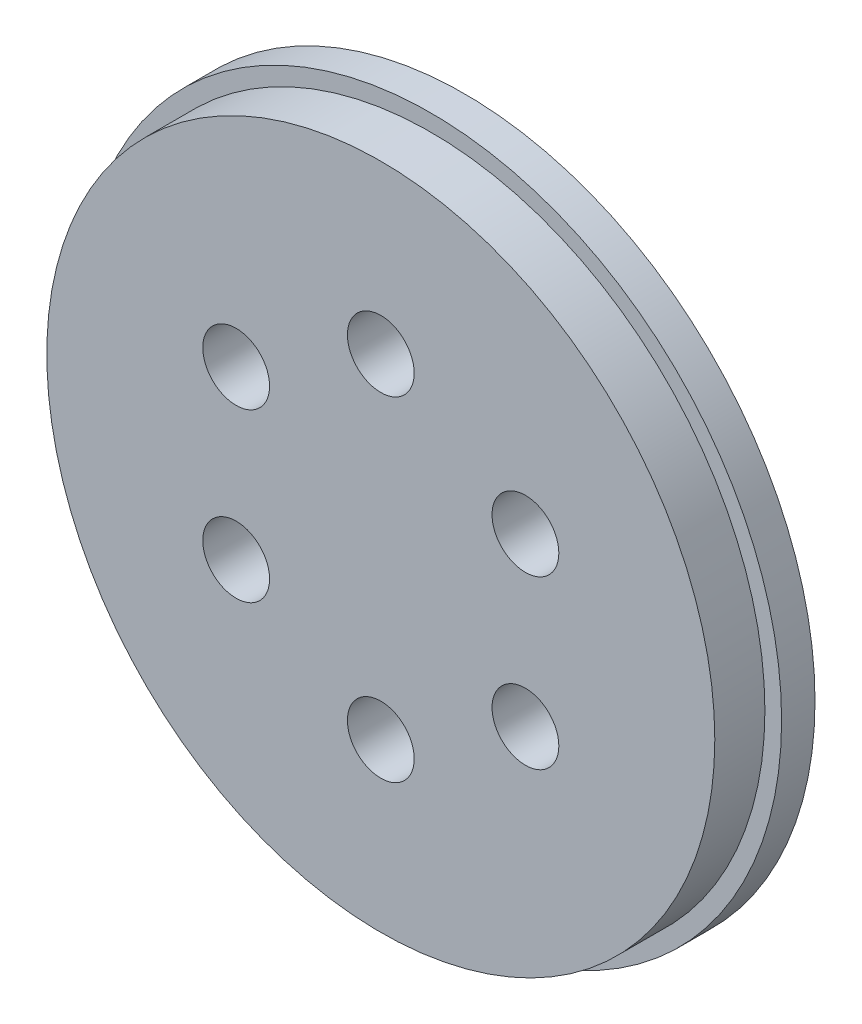
ISO-10303-21;
HEADER;
FILE_DESCRIPTION(('STEP AP214'),'2;1');
FILE_NAME('part.step','',(''),(''),'','','');
FILE_SCHEMA(('AUTOMOTIVE_DESIGN { 1 0 10303 214 1 1 1 1 }'));
ENDSEC;
DATA;
#1=APPLICATION_CONTEXT('core data for automotive mechanical design processes');
#2=APPLICATION_PROTOCOL_DEFINITION('international standard','automotive_design',2000,#1);
#3=PRODUCT_CONTEXT('',#1,'mechanical');
#4=PRODUCT('Part','Part','',(#3));
#5=PRODUCT_RELATED_PRODUCT_CATEGORY('part','',(#4));
#6=PRODUCT_DEFINITION_FORMATION('','',#4);
#7=PRODUCT_DEFINITION_CONTEXT('part definition',#1,'design');
#8=PRODUCT_DEFINITION('design','',#6,#7);
#9=PRODUCT_DEFINITION_SHAPE('','',#8);
#10=(LENGTH_UNIT() NAMED_UNIT(*) SI_UNIT(.MILLI.,.METRE.));
#11=(NAMED_UNIT(*) PLANE_ANGLE_UNIT() SI_UNIT($,.RADIAN.));
#12=(NAMED_UNIT(*) SI_UNIT($,.STERADIAN.) SOLID_ANGLE_UNIT());
#13=UNCERTAINTY_MEASURE_WITH_UNIT(LENGTH_MEASURE(1.E-05),#10,'distance_accuracy_value','');
#14=(GEOMETRIC_REPRESENTATION_CONTEXT(3) GLOBAL_UNCERTAINTY_ASSIGNED_CONTEXT((#13)) GLOBAL_UNIT_ASSIGNED_CONTEXT((#10,
#11,#12)) REPRESENTATION_CONTEXT('',''));
#15=CARTESIAN_POINT('',(0.,0.,0.));
#16=DIRECTION('',(0.,0.,1.));
#17=DIRECTION('',(1.,0.,0.));
#18=AXIS2_PLACEMENT_3D('',#15,#16,#17);
#19=CARTESIAN_POINT('',(0.,0.,2.));
#20=DIRECTION('',(0.,0.,-1.));
#21=DIRECTION('',(-1.,0.,0.));
#22=AXIS2_PLACEMENT_3D('',#19,#20,#21);
#23=CYLINDRICAL_SURFACE('',#22,21.);
#24=CARTESIAN_POINT('',(0.,0.,2.));
#25=DIRECTION('',(0.,0.,1.));
#26=DIRECTION('',(1.,0.,0.));
#27=AXIS2_PLACEMENT_3D('',#24,#25,#26);
#28=CIRCLE('',#27,21.);
#29=CARTESIAN_POINT('',(21.,0.,2.));
#30=VERTEX_POINT('',#29);
#31=EDGE_CURVE('E10',#30,#30,#28,.T.);
#32=ORIENTED_EDGE('',*,*,#31,.F.);
#33=EDGE_LOOP('',(#32));
#34=FACE_BOUND('',#33,.T.);
#35=CARTESIAN_POINT('',(0.,0.,0.));
#36=DIRECTION('',(0.,0.,1.));
#37=DIRECTION('',(1.,0.,0.));
#38=AXIS2_PLACEMENT_3D('',#35,#36,#37);
#39=CIRCLE('',#38,21.);
#40=CARTESIAN_POINT('',(21.,0.,0.));
#41=VERTEX_POINT('',#40);
#42=EDGE_CURVE('E37',#41,#41,#39,.T.);
#43=ORIENTED_EDGE('',*,*,#42,.T.);
#44=EDGE_LOOP('',(#43));
#45=FACE_BOUND('',#44,.T.);
#46=ADVANCED_FACE('F34',(#34,#45),#23,.T.);
#47=CARTESIAN_POINT('',(0.,0.,2.));
#48=DIRECTION('',(0.,0.,1.));
#49=DIRECTION('',(1.,0.,0.));
#50=AXIS2_PLACEMENT_3D('',#47,#48,#49);
#51=PLANE('',#50);
#52=CARTESIAN_POINT('',(0.,0.,2.));
#53=DIRECTION('',(0.,0.,1.));
#54=DIRECTION('',(1.,0.,0.));
#55=AXIS2_PLACEMENT_3D('',#52,#53,#54);
#56=CIRCLE('',#55,20.);
#57=CARTESIAN_POINT('',(20.,0.,2.));
#58=VERTEX_POINT('',#57);
#59=EDGE_CURVE('E46',#58,#58,#56,.T.);
#60=ORIENTED_EDGE('',*,*,#59,.F.);
#61=EDGE_LOOP('',(#60));
#62=FACE_BOUND('',#61,.T.);
#63=ORIENTED_EDGE('',*,*,#31,.T.);
#64=EDGE_LOOP('',(#63));
#65=FACE_BOUND('',#64,.T.);
#66=ADVANCED_FACE('F121',(#62,#65),#51,.T.);
#67=CARTESIAN_POINT('',(0.,0.,0.));
#68=DIRECTION('',(0.,0.,1.));
#69=DIRECTION('',(1.,0.,0.));
#70=AXIS2_PLACEMENT_3D('',#67,#68,#69);
#71=PLANE('',#70);
#72=CARTESIAN_POINT('',(8.66025403784502,5.00000000000111,0.));
#73=DIRECTION('',(0.,0.,1.));
#74=DIRECTION('',(1.,0.,0.));
#75=AXIS2_PLACEMENT_3D('',#72,#73,#74);
#76=CIRCLE('',#75,2.);
#77=CARTESIAN_POINT('',(10.660254037845,5.00000000000111,0.));
#78=VERTEX_POINT('',#77);
#79=EDGE_CURVE('E55',#78,#78,#76,.T.);
#80=ORIENTED_EDGE('',*,*,#79,.T.);
#81=EDGE_LOOP('',(#80));
#82=FACE_BOUND('',#81,.T.);
#83=CARTESIAN_POINT('',(8.6602540378463,-4.99999999999889,0.));
#84=DIRECTION('',(0.,0.,1.));
#85=DIRECTION('',(1.,0.,0.));
#86=AXIS2_PLACEMENT_3D('',#83,#84,#85);
#87=CIRCLE('',#86,2.);
#88=CARTESIAN_POINT('',(10.6602540378463,-4.99999999999889,0.));
#89=VERTEX_POINT('',#88);
#90=EDGE_CURVE('E79',#89,#89,#87,.T.);
#91=ORIENTED_EDGE('',*,*,#90,.T.);
#92=EDGE_LOOP('',(#91));
#93=FACE_BOUND('',#92,.T.);
#94=CARTESIAN_POINT('',(2.55366758493934E-12,-10.,0.));
#95=DIRECTION('',(0.,0.,1.));
#96=DIRECTION('',(1.,0.,0.));
#97=AXIS2_PLACEMENT_3D('',#94,#95,#96);
#98=CIRCLE('',#97,2.);
#99=CARTESIAN_POINT('',(2.00000000000255,-10.,0.));
#100=VERTEX_POINT('',#99);
#101=EDGE_CURVE('E73',#100,#100,#98,.T.);
#102=ORIENTED_EDGE('',*,*,#101,.T.);
#103=EDGE_LOOP('',(#102));
#104=FACE_BOUND('',#103,.T.);
#105=CARTESIAN_POINT('',(-8.66025403784247,-5.00000000000111,0.));
#106=DIRECTION('',(0.,0.,1.));
#107=DIRECTION('',(1.,0.,0.));
#108=AXIS2_PLACEMENT_3D('',#105,#106,#107);
#109=CIRCLE('',#108,2.);
#110=CARTESIAN_POINT('',(-6.66025403784247,-5.00000000000111,0.));
#111=VERTEX_POINT('',#110);
#112=EDGE_CURVE('E67',#111,#111,#109,.T.);
#113=ORIENTED_EDGE('',*,*,#112,.T.);
#114=EDGE_LOOP('',(#113));
#115=FACE_BOUND('',#114,.T.);
#116=CARTESIAN_POINT('',(-8.66025403784375,4.99999999999889,0.));
#117=DIRECTION('',(0.,0.,1.));
#118=DIRECTION('',(1.,0.,0.));
#119=AXIS2_PLACEMENT_3D('',#116,#117,#118);
#120=CIRCLE('',#119,2.);
#121=CARTESIAN_POINT('',(-6.66025403784375,4.99999999999889,0.));
#122=VERTEX_POINT('',#121);
#123=EDGE_CURVE('E61',#122,#122,#120,.T.);
#124=ORIENTED_EDGE('',*,*,#123,.T.);
#125=EDGE_LOOP('',(#124));
#126=FACE_BOUND('',#125,.T.);
#127=CARTESIAN_POINT('',(0.,10.,0.));
#128=DIRECTION('',(0.,0.,1.));
#129=DIRECTION('',(1.,0.,0.));
#130=AXIS2_PLACEMENT_3D('',#127,#128,#129);
#131=CIRCLE('',#130,2.);
#132=CARTESIAN_POINT('',(2.,10.,0.));
#133=VERTEX_POINT('',#132);
#134=EDGE_CURVE('E49',#133,#133,#131,.T.);
#135=ORIENTED_EDGE('',*,*,#134,.T.);
#136=EDGE_LOOP('',(#135));
#137=FACE_BOUND('',#136,.T.);
#138=ORIENTED_EDGE('',*,*,#42,.F.);
#139=EDGE_LOOP('',(#138));
#140=FACE_BOUND('',#139,.T.);
#141=ADVANCED_FACE('F88',(#82,#93,#104,#115,#126,#137,#140),#71,.F.);
#142=CARTESIAN_POINT('',(0.,0.,5.));
#143=DIRECTION('',(0.,0.,-1.));
#144=DIRECTION('',(-1.,0.,0.));
#145=AXIS2_PLACEMENT_3D('',#142,#143,#144);
#146=CYLINDRICAL_SURFACE('',#145,20.);
#147=CARTESIAN_POINT('',(0.,0.,5.));
#148=DIRECTION('',(0.,0.,1.));
#149=DIRECTION('',(1.,0.,0.));
#150=AXIS2_PLACEMENT_3D('',#147,#148,#149);
#151=CIRCLE('',#150,20.);
#152=CARTESIAN_POINT('',(20.,0.,5.));
#153=VERTEX_POINT('',#152);
#154=EDGE_CURVE('E44',#153,#153,#151,.T.);
#155=ORIENTED_EDGE('',*,*,#154,.F.);
#156=EDGE_LOOP('',(#155));
#157=FACE_BOUND('',#156,.T.);
#158=ORIENTED_EDGE('',*,*,#59,.T.);
#159=EDGE_LOOP('',(#158));
#160=FACE_BOUND('',#159,.T.);
#161=ADVANCED_FACE('F102',(#157,#160),#146,.T.);
#162=CARTESIAN_POINT('',(0.,0.,5.));
#163=DIRECTION('',(0.,0.,1.));
#164=DIRECTION('',(1.,0.,0.));
#165=AXIS2_PLACEMENT_3D('',#162,#163,#164);
#166=PLANE('',#165);
#167=CARTESIAN_POINT('',(8.66025403784502,5.00000000000111,5.));
#168=DIRECTION('',(0.,0.,1.));
#169=DIRECTION('',(1.,0.,0.));
#170=AXIS2_PLACEMENT_3D('',#167,#168,#169);
#171=CIRCLE('',#170,2.);
#172=CARTESIAN_POINT('',(10.660254037845,5.00000000000111,5.));
#173=VERTEX_POINT('',#172);
#174=EDGE_CURVE('E82',#173,#173,#171,.T.);
#175=ORIENTED_EDGE('',*,*,#174,.F.);
#176=EDGE_LOOP('',(#175));
#177=FACE_BOUND('',#176,.T.);
#178=CARTESIAN_POINT('',(8.6602540378463,-4.99999999999889,5.));
#179=DIRECTION('',(0.,0.,1.));
#180=DIRECTION('',(1.,0.,0.));
#181=AXIS2_PLACEMENT_3D('',#178,#179,#180);
#182=CIRCLE('',#181,2.);
#183=CARTESIAN_POINT('',(10.6602540378463,-4.99999999999889,5.));
#184=VERTEX_POINT('',#183);
#185=EDGE_CURVE('E76',#184,#184,#182,.T.);
#186=ORIENTED_EDGE('',*,*,#185,.F.);
#187=EDGE_LOOP('',(#186));
#188=FACE_BOUND('',#187,.T.);
#189=CARTESIAN_POINT('',(2.55366758493934E-12,-10.,5.));
#190=DIRECTION('',(0.,0.,1.));
#191=DIRECTION('',(1.,0.,0.));
#192=AXIS2_PLACEMENT_3D('',#189,#190,#191);
#193=CIRCLE('',#192,2.);
#194=CARTESIAN_POINT('',(2.00000000000255,-10.,5.));
#195=VERTEX_POINT('',#194);
#196=EDGE_CURVE('E70',#195,#195,#193,.T.);
#197=ORIENTED_EDGE('',*,*,#196,.F.);
#198=EDGE_LOOP('',(#197));
#199=FACE_BOUND('',#198,.T.);
#200=CARTESIAN_POINT('',(-8.66025403784247,-5.00000000000111,5.));
#201=DIRECTION('',(0.,0.,1.));
#202=DIRECTION('',(1.,0.,0.));
#203=AXIS2_PLACEMENT_3D('',#200,#201,#202);
#204=CIRCLE('',#203,2.);
#205=CARTESIAN_POINT('',(-6.66025403784247,-5.00000000000111,5.));
#206=VERTEX_POINT('',#205);
#207=EDGE_CURVE('E64',#206,#206,#204,.T.);
#208=ORIENTED_EDGE('',*,*,#207,.F.);
#209=EDGE_LOOP('',(#208));
#210=FACE_BOUND('',#209,.T.);
#211=CARTESIAN_POINT('',(-8.66025403784375,4.99999999999889,5.));
#212=DIRECTION('',(0.,0.,1.));
#213=DIRECTION('',(1.,0.,0.));
#214=AXIS2_PLACEMENT_3D('',#211,#212,#213);
#215=CIRCLE('',#214,2.);
#216=CARTESIAN_POINT('',(-6.66025403784375,4.99999999999889,5.));
#217=VERTEX_POINT('',#216);
#218=EDGE_CURVE('E58',#217,#217,#215,.T.);
#219=ORIENTED_EDGE('',*,*,#218,.F.);
#220=EDGE_LOOP('',(#219));
#221=FACE_BOUND('',#220,.T.);
#222=CARTESIAN_POINT('',(0.,10.,5.));
#223=DIRECTION('',(0.,0.,1.));
#224=DIRECTION('',(1.,0.,0.));
#225=AXIS2_PLACEMENT_3D('',#222,#223,#224);
#226=CIRCLE('',#225,2.);
#227=CARTESIAN_POINT('',(2.,10.,5.));
#228=VERTEX_POINT('',#227);
#229=EDGE_CURVE('E52',#228,#228,#226,.T.);
#230=ORIENTED_EDGE('',*,*,#229,.F.);
#231=EDGE_LOOP('',(#230));
#232=FACE_BOUND('',#231,.T.);
#233=ORIENTED_EDGE('',*,*,#154,.T.);
#234=EDGE_LOOP('',(#233));
#235=FACE_BOUND('',#234,.T.);
#236=ADVANCED_FACE('F98',(#177,#188,#199,#210,#221,#232,#235),#166,.T.);
#237=CARTESIAN_POINT('',(0.,10.,0.));
#238=DIRECTION('',(0.,0.,1.));
#239=DIRECTION('',(1.,0.,0.));
#240=AXIS2_PLACEMENT_3D('',#237,#238,#239);
#241=CYLINDRICAL_SURFACE('',#240,2.);
#242=ORIENTED_EDGE('',*,*,#134,.F.);
#243=EDGE_LOOP('',(#242));
#244=FACE_BOUND('',#243,.T.);
#245=ORIENTED_EDGE('',*,*,#229,.T.);
#246=EDGE_LOOP('',(#245));
#247=FACE_BOUND('',#246,.T.);
#248=ADVANCED_FACE('F101',(#244,#247),#241,.F.);
#249=CARTESIAN_POINT('',(-8.66025403784375,4.99999999999889,0.));
#250=DIRECTION('',(0.,0.,1.));
#251=DIRECTION('',(1.,0.,0.));
#252=AXIS2_PLACEMENT_3D('',#249,#250,#251);
#253=CYLINDRICAL_SURFACE('',#252,2.);
#254=ORIENTED_EDGE('',*,*,#123,.F.);
#255=EDGE_LOOP('',(#254));
#256=FACE_BOUND('',#255,.T.);
#257=ORIENTED_EDGE('',*,*,#218,.T.);
#258=EDGE_LOOP('',(#257));
#259=FACE_BOUND('',#258,.T.);
#260=ADVANCED_FACE('F132',(#256,#259),#253,.F.);
#261=CARTESIAN_POINT('',(-8.66025403784247,-5.00000000000111,0.));
#262=DIRECTION('',(0.,0.,1.));
#263=DIRECTION('',(1.,0.,0.));
#264=AXIS2_PLACEMENT_3D('',#261,#262,#263);
#265=CYLINDRICAL_SURFACE('',#264,2.);
#266=ORIENTED_EDGE('',*,*,#112,.F.);
#267=EDGE_LOOP('',(#266));
#268=FACE_BOUND('',#267,.T.);
#269=ORIENTED_EDGE('',*,*,#207,.T.);
#270=EDGE_LOOP('',(#269));
#271=FACE_BOUND('',#270,.T.);
#272=ADVANCED_FACE('F136',(#268,#271),#265,.F.);
#273=CARTESIAN_POINT('',(2.55366758493934E-12,-10.,0.));
#274=DIRECTION('',(0.,0.,1.));
#275=DIRECTION('',(1.,0.,0.));
#276=AXIS2_PLACEMENT_3D('',#273,#274,#275);
#277=CYLINDRICAL_SURFACE('',#276,2.);
#278=ORIENTED_EDGE('',*,*,#101,.F.);
#279=EDGE_LOOP('',(#278));
#280=FACE_BOUND('',#279,.T.);
#281=ORIENTED_EDGE('',*,*,#196,.T.);
#282=EDGE_LOOP('',(#281));
#283=FACE_BOUND('',#282,.T.);
#284=ADVANCED_FACE('F140',(#280,#283),#277,.F.);
#285=CARTESIAN_POINT('',(8.6602540378463,-4.99999999999889,0.));
#286=DIRECTION('',(0.,0.,1.));
#287=DIRECTION('',(1.,0.,0.));
#288=AXIS2_PLACEMENT_3D('',#285,#286,#287);
#289=CYLINDRICAL_SURFACE('',#288,2.);
#290=ORIENTED_EDGE('',*,*,#90,.F.);
#291=EDGE_LOOP('',(#290));
#292=FACE_BOUND('',#291,.T.);
#293=ORIENTED_EDGE('',*,*,#185,.T.);
#294=EDGE_LOOP('',(#293));
#295=FACE_BOUND('',#294,.T.);
#296=ADVANCED_FACE('F94',(#292,#295),#289,.F.);
#297=CARTESIAN_POINT('',(8.66025403784502,5.00000000000111,0.));
#298=DIRECTION('',(0.,0.,1.));
#299=DIRECTION('',(1.,0.,0.));
#300=AXIS2_PLACEMENT_3D('',#297,#298,#299);
#301=CYLINDRICAL_SURFACE('',#300,2.);
#302=ORIENTED_EDGE('',*,*,#79,.F.);
#303=EDGE_LOOP('',(#302));
#304=FACE_BOUND('',#303,.T.);
#305=ORIENTED_EDGE('',*,*,#174,.T.);
#306=EDGE_LOOP('',(#305));
#307=FACE_BOUND('',#306,.T.);
#308=ADVANCED_FACE('F91',(#304,#307),#301,.F.);
#309=CLOSED_SHELL('',(#46,#66,#141,#161,#236,#248,#260,#272,#284,#296,#308));
#310=MANIFOLD_SOLID_BREP('B2',#309);
#311=ADVANCED_BREP_SHAPE_REPRESENTATION('',(#18,#310),#14);
#312=SHAPE_DEFINITION_REPRESENTATION(#9,#311);
ENDSEC;
END-ISO-10303-21;
